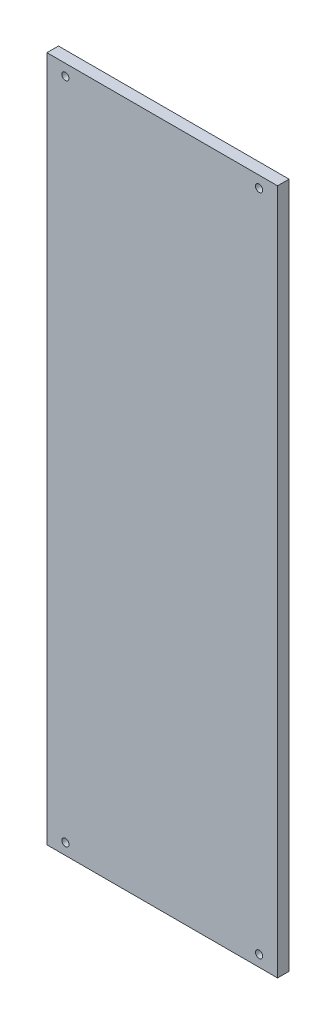
ISO-10303-21;
HEADER;
FILE_DESCRIPTION(('STEP AP214'),'2;1');
FILE_NAME('part.step','',(''),(''),'','','');
FILE_SCHEMA(('AUTOMOTIVE_DESIGN { 1 0 10303 214 1 1 1 1 }'));
ENDSEC;
DATA;
#1=APPLICATION_CONTEXT('core data for automotive mechanical design processes');
#2=APPLICATION_PROTOCOL_DEFINITION('international standard','automotive_design',2000,#1);
#3=PRODUCT_CONTEXT('',#1,'mechanical');
#4=PRODUCT('Part','Part','',(#3));
#5=PRODUCT_RELATED_PRODUCT_CATEGORY('part','',(#4));
#6=PRODUCT_DEFINITION_FORMATION('','',#4);
#7=PRODUCT_DEFINITION_CONTEXT('part definition',#1,'design');
#8=PRODUCT_DEFINITION('design','',#6,#7);
#9=PRODUCT_DEFINITION_SHAPE('','',#8);
#10=(LENGTH_UNIT() NAMED_UNIT(*) SI_UNIT(.MILLI.,.METRE.));
#11=(NAMED_UNIT(*) PLANE_ANGLE_UNIT() SI_UNIT($,.RADIAN.));
#12=(NAMED_UNIT(*) SI_UNIT($,.STERADIAN.) SOLID_ANGLE_UNIT());
#13=UNCERTAINTY_MEASURE_WITH_UNIT(LENGTH_MEASURE(1.E-05),#10,'distance_accuracy_value','');
#14=(GEOMETRIC_REPRESENTATION_CONTEXT(3) GLOBAL_UNCERTAINTY_ASSIGNED_CONTEXT((#13)) GLOBAL_UNIT_ASSIGNED_CONTEXT((#10,
#11,#12)) REPRESENTATION_CONTEXT('',''));
#15=CARTESIAN_POINT('',(0.,0.,0.));
#16=DIRECTION('',(0.,0.,1.));
#17=DIRECTION('',(1.,0.,0.));
#18=AXIS2_PLACEMENT_3D('',#15,#16,#17);
#19=CARTESIAN_POINT('',(0.,0.,0.));
#20=DIRECTION('',(0.,0.,1.));
#21=DIRECTION('',(1.,0.,0.));
#22=AXIS2_PLACEMENT_3D('',#19,#20,#21);
#23=PLANE('',#22);
#24=CARTESIAN_POINT('',(106.68,365.378999999999,0.));
#25=DIRECTION('',(0.,0.,-1.));
#26=DIRECTION('',(-1.,0.,0.));
#27=AXIS2_PLACEMENT_3D('',#24,#25,#26);
#28=CIRCLE('',#27,3.96874999999999);
#29=CARTESIAN_POINT('',(102.71125,365.378999999999,0.));
#30=VERTEX_POINT('',#29);
#31=EDGE_CURVE('E132',#30,#30,#28,.T.);
#32=ORIENTED_EDGE('',*,*,#31,.F.);
#33=EDGE_LOOP('',(#32));
#34=FACE_BOUND('',#33,.T.);
#35=CARTESIAN_POINT('',(106.68,-365.379000000001,0.));
#36=DIRECTION('',(0.,0.,-1.));
#37=DIRECTION('',(-1.,0.,0.));
#38=AXIS2_PLACEMENT_3D('',#35,#36,#37);
#39=CIRCLE('',#38,3.96874999999999);
#40=CARTESIAN_POINT('',(102.71125,-365.379000000001,0.));
#41=VERTEX_POINT('',#40);
#42=EDGE_CURVE('E120',#41,#41,#39,.T.);
#43=ORIENTED_EDGE('',*,*,#42,.F.);
#44=EDGE_LOOP('',(#43));
#45=FACE_BOUND('',#44,.T.);
#46=CARTESIAN_POINT('',(-106.68,-365.379000000001,0.));
#47=DIRECTION('',(0.,0.,-1.));
#48=DIRECTION('',(-1.,0.,0.));
#49=AXIS2_PLACEMENT_3D('',#46,#47,#48);
#50=CIRCLE('',#49,3.96874999999999);
#51=CARTESIAN_POINT('',(-110.64875,-365.379000000001,0.));
#52=VERTEX_POINT('',#51);
#53=EDGE_CURVE('E114',#52,#52,#50,.T.);
#54=ORIENTED_EDGE('',*,*,#53,.F.);
#55=EDGE_LOOP('',(#54));
#56=FACE_BOUND('',#55,.T.);
#57=DIRECTION('',(0.,1.,0.));
#58=VECTOR('',#57,1.);
#59=CARTESIAN_POINT('',(127.,377.824999999999,0.));
#60=LINE('',#59,#58);
#61=CARTESIAN_POINT('',(127.,-377.825000000001,0.));
#62=VERTEX_POINT('',#61);
#63=CARTESIAN_POINT('',(127.,377.824999999999,0.));
#64=VERTEX_POINT('',#63);
#65=EDGE_CURVE('E98',#62,#64,#60,.T.);
#66=ORIENTED_EDGE('',*,*,#65,.F.);
#67=DIRECTION('',(1.,0.,0.));
#68=VECTOR('',#67,1.);
#69=CARTESIAN_POINT('',(-127.,-377.825000000001,0.));
#70=LINE('',#69,#68);
#71=CARTESIAN_POINT('',(-127.,-377.825000000001,0.));
#72=VERTEX_POINT('',#71);
#73=EDGE_CURVE('E74',#72,#62,#70,.T.);
#74=ORIENTED_EDGE('',*,*,#73,.F.);
#75=DIRECTION('',(0.,-1.,0.));
#76=VECTOR('',#75,1.);
#77=CARTESIAN_POINT('',(-127.,377.824999999999,0.));
#78=LINE('',#77,#76);
#79=CARTESIAN_POINT('',(-127.,377.824999999999,0.));
#80=VERTEX_POINT('',#79);
#81=EDGE_CURVE('E68',#80,#72,#78,.T.);
#82=ORIENTED_EDGE('',*,*,#81,.F.);
#83=DIRECTION('',(-1.,0.,0.));
#84=VECTOR('',#83,1.);
#85=CARTESIAN_POINT('',(-127.,377.824999999999,0.));
#86=LINE('',#85,#84);
#87=EDGE_CURVE('E90',#64,#80,#86,.T.);
#88=ORIENTED_EDGE('',*,*,#87,.F.);
#89=EDGE_LOOP('',(#66,#74,#82,#88));
#90=FACE_BOUND('',#89,.T.);
#91=CARTESIAN_POINT('',(-106.68,365.378999999999,0.));
#92=DIRECTION('',(0.,0.,-1.));
#93=DIRECTION('',(-1.,0.,0.));
#94=AXIS2_PLACEMENT_3D('',#91,#92,#93);
#95=CIRCLE('',#94,3.96874999999999);
#96=CARTESIAN_POINT('',(-110.64875,365.378999999999,0.));
#97=VERTEX_POINT('',#96);
#98=EDGE_CURVE('E126',#97,#97,#95,.T.);
#99=ORIENTED_EDGE('',*,*,#98,.F.);
#100=EDGE_LOOP('',(#99));
#101=FACE_BOUND('',#100,.T.);
#102=ADVANCED_FACE('F34',(#34,#45,#56,#90,#101),#23,.F.);
#103=CARTESIAN_POINT('',(127.,377.824999999999,12.7));
#104=DIRECTION('',(-1.,0.,0.));
#105=DIRECTION('',(0.,-1.,0.));
#106=AXIS2_PLACEMENT_3D('',#103,#104,#105);
#107=PLANE('',#106);
#108=ORIENTED_EDGE('',*,*,#65,.T.);
#109=DIRECTION('',(0.,0.,-1.));
#110=VECTOR('',#109,1.);
#111=CARTESIAN_POINT('',(127.,377.824999999999,12.7));
#112=LINE('',#111,#110);
#113=CARTESIAN_POINT('',(127.,377.824999999999,12.7));
#114=VERTEX_POINT('',#113);
#115=EDGE_CURVE('E11',#114,#64,#112,.T.);
#116=ORIENTED_EDGE('',*,*,#115,.F.);
#117=DIRECTION('',(0.,1.,0.));
#118=VECTOR('',#117,1.);
#119=CARTESIAN_POINT('',(127.,377.824999999999,12.7));
#120=LINE('',#119,#118);
#121=CARTESIAN_POINT('',(127.,-377.825000000001,12.7));
#122=VERTEX_POINT('',#121);
#123=EDGE_CURVE('E86',#122,#114,#120,.T.);
#124=ORIENTED_EDGE('',*,*,#123,.F.);
#125=DIRECTION('',(0.,0.,-1.));
#126=VECTOR('',#125,1.);
#127=CARTESIAN_POINT('',(127.,-377.825000000001,12.7));
#128=LINE('',#127,#126);
#129=EDGE_CURVE('E94',#122,#62,#128,.T.);
#130=ORIENTED_EDGE('',*,*,#129,.T.);
#131=EDGE_LOOP('',(#108,#116,#124,#130));
#132=FACE_BOUND('',#131,.T.);
#133=ADVANCED_FACE('F36',(#132),#107,.F.);
#134=CARTESIAN_POINT('',(-127.,377.824999999999,12.7));
#135=DIRECTION('',(0.,-1.,0.));
#136=DIRECTION('',(0.,0.,-1.));
#137=AXIS2_PLACEMENT_3D('',#134,#135,#136);
#138=PLANE('',#137);
#139=ORIENTED_EDGE('',*,*,#87,.T.);
#140=DIRECTION('',(0.,0.,-1.));
#141=VECTOR('',#140,1.);
#142=CARTESIAN_POINT('',(-127.,377.824999999999,12.7));
#143=LINE('',#142,#141);
#144=CARTESIAN_POINT('',(-127.,377.824999999999,12.7));
#145=VERTEX_POINT('',#144);
#146=EDGE_CURVE('E43',#145,#80,#143,.T.);
#147=ORIENTED_EDGE('',*,*,#146,.F.);
#148=DIRECTION('',(-1.,0.,0.));
#149=VECTOR('',#148,1.);
#150=CARTESIAN_POINT('',(-127.,377.824999999999,12.7));
#151=LINE('',#150,#149);
#152=EDGE_CURVE('E81',#114,#145,#151,.T.);
#153=ORIENTED_EDGE('',*,*,#152,.F.);
#154=ORIENTED_EDGE('',*,*,#115,.T.);
#155=EDGE_LOOP('',(#139,#147,#153,#154));
#156=FACE_BOUND('',#155,.T.);
#157=ADVANCED_FACE('F89',(#156),#138,.F.);
#158=CARTESIAN_POINT('',(-127.,377.824999999999,12.7));
#159=DIRECTION('',(1.,0.,0.));
#160=DIRECTION('',(0.,1.,0.));
#161=AXIS2_PLACEMENT_3D('',#158,#159,#160);
#162=PLANE('',#161);
#163=ORIENTED_EDGE('',*,*,#81,.T.);
#164=DIRECTION('',(0.,0.,-1.));
#165=VECTOR('',#164,1.);
#166=CARTESIAN_POINT('',(-127.,-377.825000000001,12.7));
#167=LINE('',#166,#165);
#168=CARTESIAN_POINT('',(-127.,-377.825000000001,12.7));
#169=VERTEX_POINT('',#168);
#170=EDGE_CURVE('E91',#169,#72,#167,.T.);
#171=ORIENTED_EDGE('',*,*,#170,.F.);
#172=DIRECTION('',(0.,-1.,0.));
#173=VECTOR('',#172,1.);
#174=CARTESIAN_POINT('',(-127.,377.824999999999,12.7));
#175=LINE('',#174,#173);
#176=EDGE_CURVE('E84',#145,#169,#175,.T.);
#177=ORIENTED_EDGE('',*,*,#176,.F.);
#178=ORIENTED_EDGE('',*,*,#146,.T.);
#179=EDGE_LOOP('',(#163,#171,#177,#178));
#180=FACE_BOUND('',#179,.T.);
#181=ADVANCED_FACE('F92',(#180),#162,.F.);
#182=CARTESIAN_POINT('',(-127.,-377.825000000001,12.7));
#183=DIRECTION('',(0.,1.,0.));
#184=DIRECTION('',(0.,0.,1.));
#185=AXIS2_PLACEMENT_3D('',#182,#183,#184);
#186=PLANE('',#185);
#187=ORIENTED_EDGE('',*,*,#73,.T.);
#188=ORIENTED_EDGE('',*,*,#129,.F.);
#189=DIRECTION('',(1.,0.,0.));
#190=VECTOR('',#189,1.);
#191=CARTESIAN_POINT('',(-127.,-377.825000000001,12.7));
#192=LINE('',#191,#190);
#193=EDGE_CURVE('E51',#169,#122,#192,.T.);
#194=ORIENTED_EDGE('',*,*,#193,.F.);
#195=ORIENTED_EDGE('',*,*,#170,.T.);
#196=EDGE_LOOP('',(#187,#188,#194,#195));
#197=FACE_BOUND('',#196,.T.);
#198=ADVANCED_FACE('F106',(#197),#186,.F.);
#199=CARTESIAN_POINT('',(0.,0.,12.7));
#200=DIRECTION('',(0.,0.,1.));
#201=DIRECTION('',(1.,0.,0.));
#202=AXIS2_PLACEMENT_3D('',#199,#200,#201);
#203=PLANE('',#202);
#204=CARTESIAN_POINT('',(106.68,365.378999999999,12.7));
#205=DIRECTION('',(0.,0.,-1.));
#206=DIRECTION('',(-1.,0.,0.));
#207=AXIS2_PLACEMENT_3D('',#204,#205,#206);
#208=CIRCLE('',#207,3.96874999999999);
#209=CARTESIAN_POINT('',(102.71125,365.378999999999,12.7));
#210=VERTEX_POINT('',#209);
#211=EDGE_CURVE('E129',#210,#210,#208,.T.);
#212=ORIENTED_EDGE('',*,*,#211,.T.);
#213=EDGE_LOOP('',(#212));
#214=FACE_BOUND('',#213,.T.);
#215=CARTESIAN_POINT('',(-106.68,365.378999999999,12.7));
#216=DIRECTION('',(0.,0.,-1.));
#217=DIRECTION('',(-1.,0.,0.));
#218=AXIS2_PLACEMENT_3D('',#215,#216,#217);
#219=CIRCLE('',#218,3.96874999999999);
#220=CARTESIAN_POINT('',(-110.64875,365.378999999999,12.7));
#221=VERTEX_POINT('',#220);
#222=EDGE_CURVE('E123',#221,#221,#219,.T.);
#223=ORIENTED_EDGE('',*,*,#222,.T.);
#224=EDGE_LOOP('',(#223));
#225=FACE_BOUND('',#224,.T.);
#226=CARTESIAN_POINT('',(106.68,-365.379000000001,12.7));
#227=DIRECTION('',(0.,0.,-1.));
#228=DIRECTION('',(-1.,0.,0.));
#229=AXIS2_PLACEMENT_3D('',#226,#227,#228);
#230=CIRCLE('',#229,3.96874999999999);
#231=CARTESIAN_POINT('',(102.71125,-365.379000000001,12.7));
#232=VERTEX_POINT('',#231);
#233=EDGE_CURVE('E117',#232,#232,#230,.T.);
#234=ORIENTED_EDGE('',*,*,#233,.T.);
#235=EDGE_LOOP('',(#234));
#236=FACE_BOUND('',#235,.T.);
#237=CARTESIAN_POINT('',(-106.68,-365.379000000001,12.7));
#238=DIRECTION('',(0.,0.,-1.));
#239=DIRECTION('',(-1.,0.,0.));
#240=AXIS2_PLACEMENT_3D('',#237,#238,#239);
#241=CIRCLE('',#240,3.96874999999999);
#242=CARTESIAN_POINT('',(-110.64875,-365.379000000001,12.7));
#243=VERTEX_POINT('',#242);
#244=EDGE_CURVE('E101',#243,#243,#241,.T.);
#245=ORIENTED_EDGE('',*,*,#244,.T.);
#246=EDGE_LOOP('',(#245));
#247=FACE_BOUND('',#246,.T.);
#248=ORIENTED_EDGE('',*,*,#123,.T.);
#249=ORIENTED_EDGE('',*,*,#152,.T.);
#250=ORIENTED_EDGE('',*,*,#176,.T.);
#251=ORIENTED_EDGE('',*,*,#193,.T.);
#252=EDGE_LOOP('',(#248,#249,#250,#251));
#253=FACE_BOUND('',#252,.T.);
#254=ADVANCED_FACE('F82',(#214,#225,#236,#247,#253),#203,.T.);
#255=CARTESIAN_POINT('',(-106.68,-365.379000000001,0.));
#256=DIRECTION('',(0.,0.,-1.));
#257=DIRECTION('',(-1.,0.,0.));
#258=AXIS2_PLACEMENT_3D('',#255,#256,#257);
#259=CYLINDRICAL_SURFACE('',#258,3.96874999999999);
#260=ORIENTED_EDGE('',*,*,#244,.F.);
#261=EDGE_LOOP('',(#260));
#262=FACE_BOUND('',#261,.T.);
#263=ORIENTED_EDGE('',*,*,#53,.T.);
#264=EDGE_LOOP('',(#263));
#265=FACE_BOUND('',#264,.T.);
#266=ADVANCED_FACE('F145',(#262,#265),#259,.F.);
#267=CARTESIAN_POINT('',(106.68,-365.379000000001,0.));
#268=DIRECTION('',(0.,0.,-1.));
#269=DIRECTION('',(-1.,0.,0.));
#270=AXIS2_PLACEMENT_3D('',#267,#268,#269);
#271=CYLINDRICAL_SURFACE('',#270,3.96874999999999);
#272=ORIENTED_EDGE('',*,*,#233,.F.);
#273=EDGE_LOOP('',(#272));
#274=FACE_BOUND('',#273,.T.);
#275=ORIENTED_EDGE('',*,*,#42,.T.);
#276=EDGE_LOOP('',(#275));
#277=FACE_BOUND('',#276,.T.);
#278=ADVANCED_FACE('F147',(#274,#277),#271,.F.);
#279=CARTESIAN_POINT('',(-106.68,365.378999999999,0.));
#280=DIRECTION('',(0.,0.,-1.));
#281=DIRECTION('',(-1.,0.,0.));
#282=AXIS2_PLACEMENT_3D('',#279,#280,#281);
#283=CYLINDRICAL_SURFACE('',#282,3.96874999999999);
#284=ORIENTED_EDGE('',*,*,#222,.F.);
#285=EDGE_LOOP('',(#284));
#286=FACE_BOUND('',#285,.T.);
#287=ORIENTED_EDGE('',*,*,#98,.T.);
#288=EDGE_LOOP('',(#287));
#289=FACE_BOUND('',#288,.T.);
#290=ADVANCED_FACE('F154',(#286,#289),#283,.F.);
#291=CARTESIAN_POINT('',(106.68,365.378999999999,0.));
#292=DIRECTION('',(0.,0.,-1.));
#293=DIRECTION('',(-1.,0.,0.));
#294=AXIS2_PLACEMENT_3D('',#291,#292,#293);
#295=CYLINDRICAL_SURFACE('',#294,3.96874999999999);
#296=ORIENTED_EDGE('',*,*,#211,.F.);
#297=EDGE_LOOP('',(#296));
#298=FACE_BOUND('',#297,.T.);
#299=ORIENTED_EDGE('',*,*,#31,.T.);
#300=EDGE_LOOP('',(#299));
#301=FACE_BOUND('',#300,.T.);
#302=ADVANCED_FACE('F136',(#298,#301),#295,.F.);
#303=CLOSED_SHELL('',(#102,#133,#157,#181,#198,#254,#266,#278,#290,#302));
#304=MANIFOLD_SOLID_BREP('B2',#303);
#305=ADVANCED_BREP_SHAPE_REPRESENTATION('',(#18,#304),#14);
#306=SHAPE_DEFINITION_REPRESENTATION(#9,#305);
ENDSEC;
END-ISO-10303-21;
